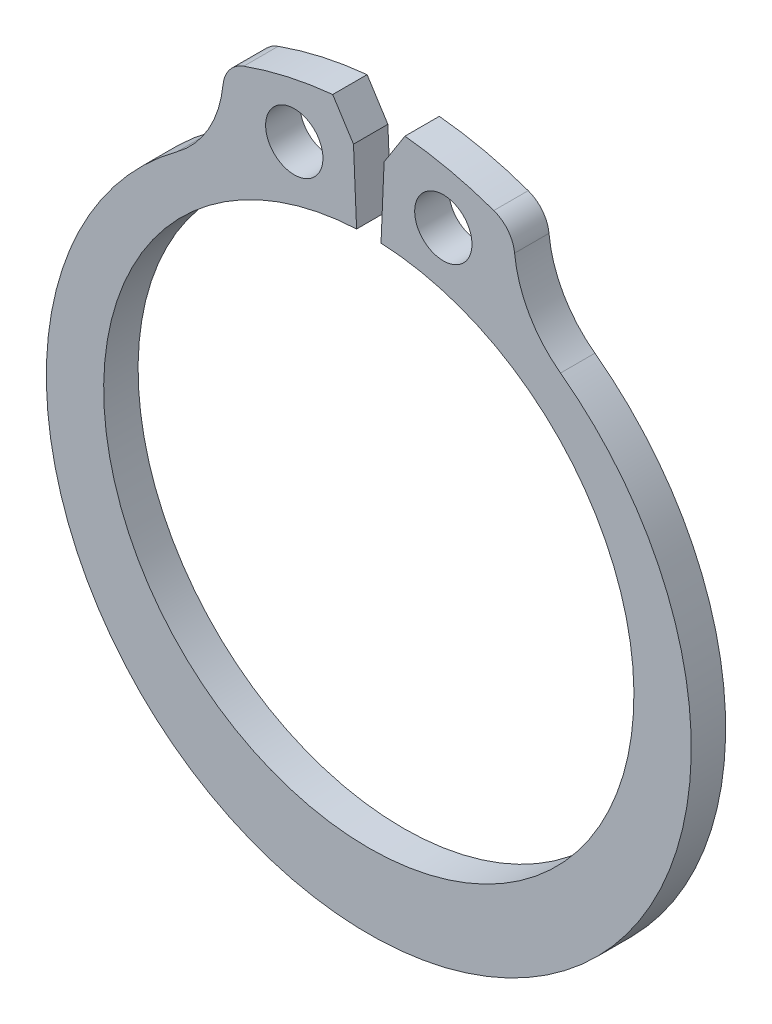
ISO-10303-21;
HEADER;
FILE_DESCRIPTION(('STEP AP214'),'2;1');
FILE_NAME('part.step','',(''),(''),'','','');
FILE_SCHEMA(('AUTOMOTIVE_DESIGN { 1 0 10303 214 1 1 1 1 }'));
ENDSEC;
DATA;
#1=APPLICATION_CONTEXT('core data for automotive mechanical design processes');
#2=APPLICATION_PROTOCOL_DEFINITION('international standard','automotive_design',2000,#1);
#3=PRODUCT_CONTEXT('',#1,'mechanical');
#4=PRODUCT('Part','Part','',(#3));
#5=PRODUCT_RELATED_PRODUCT_CATEGORY('part','',(#4));
#6=PRODUCT_DEFINITION_FORMATION('','',#4);
#7=PRODUCT_DEFINITION_CONTEXT('part definition',#1,'design');
#8=PRODUCT_DEFINITION('design','',#6,#7);
#9=PRODUCT_DEFINITION_SHAPE('','',#8);
#10=(LENGTH_UNIT() NAMED_UNIT(*) SI_UNIT(.MILLI.,.METRE.));
#11=(NAMED_UNIT(*) PLANE_ANGLE_UNIT() SI_UNIT($,.RADIAN.));
#12=(NAMED_UNIT(*) SI_UNIT($,.STERADIAN.) SOLID_ANGLE_UNIT());
#13=UNCERTAINTY_MEASURE_WITH_UNIT(LENGTH_MEASURE(1.E-05),#10,'distance_accuracy_value','');
#14=(GEOMETRIC_REPRESENTATION_CONTEXT(3) GLOBAL_UNCERTAINTY_ASSIGNED_CONTEXT((#13)) GLOBAL_UNIT_ASSIGNED_CONTEXT((#10,
#11,#12)) REPRESENTATION_CONTEXT('',''));
#15=CARTESIAN_POINT('',(0.,0.,0.));
#16=DIRECTION('',(0.,0.,1.));
#17=DIRECTION('',(1.,0.,0.));
#18=AXIS2_PLACEMENT_3D('',#15,#16,#17);
#19=CARTESIAN_POINT('',(0.,0.,0.6));
#20=DIRECTION('',(0.,0.,-1.));
#21=DIRECTION('',(1.,0.,0.));
#22=AXIS2_PLACEMENT_3D('',#19,#20,#21);
#23=CYLINDRICAL_SURFACE('',#22,9.25);
#24=DIRECTION('',(0.,0.,1.));
#25=VECTOR('',#24,1.);
#26=CARTESIAN_POINT('',(0.425920101847911,9.24018896272375,0.6));
#27=LINE('',#26,#25);
#28=CARTESIAN_POINT('',(0.425920101847911,9.24018896272375,0.));
#29=VERTEX_POINT('',#28);
#30=CARTESIAN_POINT('',(0.425920101847911,9.24018896272375,1.2));
#31=VERTEX_POINT('',#30);
#32=EDGE_CURVE('E32',#29,#31,#27,.T.);
#33=ORIENTED_EDGE('',*,*,#32,.F.);
#34=CARTESIAN_POINT('',(0.,0.,0.));
#35=DIRECTION('',(0.,0.,1.));
#36=DIRECTION('',(1.,0.,0.));
#37=AXIS2_PLACEMENT_3D('',#34,#35,#36);
#38=CIRCLE('',#37,9.25);
#39=CARTESIAN_POINT('',(-0.425920101847911,9.24018896272375,0.));
#40=VERTEX_POINT('',#39);
#41=EDGE_CURVE('E156',#40,#29,#38,.T.);
#42=ORIENTED_EDGE('',*,*,#41,.F.);
#43=DIRECTION('',(0.,0.,-1.));
#44=VECTOR('',#43,1.);
#45=CARTESIAN_POINT('',(-0.425920101847911,9.24018896272375,0.6));
#46=LINE('',#45,#44);
#47=CARTESIAN_POINT('',(-0.425920101847911,9.24018896272375,1.2));
#48=VERTEX_POINT('',#47);
#49=EDGE_CURVE('E9',#48,#40,#46,.T.);
#50=ORIENTED_EDGE('',*,*,#49,.F.);
#51=CARTESIAN_POINT('',(0.,0.,1.2));
#52=DIRECTION('',(0.,0.,-1.));
#53=DIRECTION('',(1.,0.,0.));
#54=AXIS2_PLACEMENT_3D('',#51,#52,#53);
#55=CIRCLE('',#54,9.25);
#56=EDGE_CURVE('E133',#31,#48,#55,.T.);
#57=ORIENTED_EDGE('',*,*,#56,.F.);
#58=EDGE_LOOP('',(#33,#42,#50,#57));
#59=FACE_BOUND('',#58,.T.);
#60=ADVANCED_FACE('F15',(#59),#23,.F.);
#61=CARTESIAN_POINT('',(-0.280262164671059,5.875,1.2));
#62=DIRECTION('',(0.999064573445483,0.0432432432432432,0.));
#63=DIRECTION('',(0.0432432432432432,-0.999064573445483,0.));
#64=AXIS2_PLACEMENT_3D('',#61,#62,#63);
#65=PLANE('',#64);
#66=ORIENTED_EDGE('',*,*,#49,.T.);
#67=DIRECTION('',(-0.0432432432432432,0.999064573445483,0.));
#68=VECTOR('',#67,1.);
#69=CARTESIAN_POINT('',(0.,-0.6,0.));
#70=LINE('',#69,#68);
#71=CARTESIAN_POINT('',(-0.5345540901448,11.75,0.));
#72=VERTEX_POINT('',#71);
#73=EDGE_CURVE('E24',#40,#72,#70,.T.);
#74=ORIENTED_EDGE('',*,*,#73,.T.);
#75=DIRECTION('',(0.,0.,-1.));
#76=VECTOR('',#75,1.);
#77=CARTESIAN_POINT('',(-0.5345540901448,11.75,1.2));
#78=LINE('',#77,#76);
#79=CARTESIAN_POINT('',(-0.5345540901448,11.75,1.2));
#80=VERTEX_POINT('',#79);
#81=EDGE_CURVE('E180',#80,#72,#78,.T.);
#82=ORIENTED_EDGE('',*,*,#81,.F.);
#83=DIRECTION('',(-0.0432432432432432,0.999064573445483,0.));
#84=VECTOR('',#83,1.);
#85=CARTESIAN_POINT('',(0.,-0.6,1.2));
#86=LINE('',#85,#84);
#87=EDGE_CURVE('E154',#48,#80,#86,.T.);
#88=ORIENTED_EDGE('',*,*,#87,.F.);
#89=EDGE_LOOP('',(#66,#74,#82,#88));
#90=FACE_BOUND('',#89,.T.);
#91=ADVANCED_FACE('F240',(#90),#65,.T.);
#92=CARTESIAN_POINT('',(4.16342762461539,0.248043783068695,0.));
#93=DIRECTION('',(0.,0.,1.));
#94=DIRECTION('',(1.,0.,0.));
#95=AXIS2_PLACEMENT_3D('',#92,#93,#94);
#96=PLANE('',#95);
#97=ORIENTED_EDGE('',*,*,#41,.T.);
#98=DIRECTION('',(0.0432432432432432,0.999064573445483,0.));
#99=VECTOR('',#98,1.);
#100=CARTESIAN_POINT('',(0.,-0.6,0.));
#101=LINE('',#100,#99);
#102=CARTESIAN_POINT('',(0.5345540901448,11.75,0.));
#103=VERTEX_POINT('',#102);
#104=EDGE_CURVE('E158',#29,#103,#101,.T.);
#105=ORIENTED_EDGE('',*,*,#104,.T.);
#106=DIRECTION('',(0.53698203391342,0.843593679003231,0.));
#107=VECTOR('',#106,1.);
#108=CARTESIAN_POINT('',(0.5345540901448,11.75,0.));
#109=LINE('',#108,#107);
#110=CARTESIAN_POINT('',(1.2593338033922,12.8886220509267,0.));
#111=VERTEX_POINT('',#110);
#112=EDGE_CURVE('E124',#103,#111,#109,.T.);
#113=ORIENTED_EDGE('',*,*,#112,.T.);
#114=CARTESIAN_POINT('',(0.,0.,0.));
#115=DIRECTION('',(0.,0.,1.));
#116=DIRECTION('',(1.,0.,0.));
#117=AXIS2_PLACEMENT_3D('',#114,#115,#116);
#118=CIRCLE('',#117,12.95);
#119=CARTESIAN_POINT('',(4.3619804345495,12.1932615279345,0.));
#120=VERTEX_POINT('',#119);
#121=EDGE_CURVE('E189',#120,#111,#118,.T.);
#122=ORIENTED_EDGE('',*,*,#121,.F.);
#123=CARTESIAN_POINT('',(3.99146472196228,11.1575404715076,0.));
#124=DIRECTION('',(0.,0.,1.));
#125=DIRECTION('',(1.,0.,0.));
#126=AXIS2_PLACEMENT_3D('',#123,#124,#125);
#127=CIRCLE('',#126,1.1);
#128=CARTESIAN_POINT('',(5.08606538190489,11.2663953990636,0.));
#129=VERTEX_POINT('',#128);
#130=EDGE_CURVE('E165',#129,#120,#127,.T.);
#131=ORIENTED_EDGE('',*,*,#130,.F.);
#132=CARTESIAN_POINT('',(9.06643141805981,11.6622314992671,0.));
#133=DIRECTION('',(0.,0.,1.));
#134=DIRECTION('',(1.,0.,0.));
#135=AXIS2_PLACEMENT_3D('',#132,#133,#134);
#136=CIRCLE('',#135,4.);
#137=CARTESIAN_POINT('',(6.6883510461097,8.44590848306588,0.));
#138=VERTEX_POINT('',#137);
#139=EDGE_CURVE('E120',#129,#138,#136,.T.);
#140=ORIENTED_EDGE('',*,*,#139,.T.);
#141=CARTESIAN_POINT('',(0.,-0.6,0.));
#142=DIRECTION('',(0.,0.,1.));
#143=DIRECTION('',(1.,0.,0.));
#144=AXIS2_PLACEMENT_3D('',#141,#142,#143);
#145=CIRCLE('',#144,11.25);
#146=CARTESIAN_POINT('',(-6.6883510461097,8.44590848306588,0.));
#147=VERTEX_POINT('',#146);
#148=EDGE_CURVE('E131',#147,#138,#145,.T.);
#149=ORIENTED_EDGE('',*,*,#148,.F.);
#150=CARTESIAN_POINT('',(-9.06643141805981,11.6622314992671,0.));
#151=DIRECTION('',(0.,0.,-1.));
#152=DIRECTION('',(-1.,0.,0.));
#153=AXIS2_PLACEMENT_3D('',#150,#151,#152);
#154=CIRCLE('',#153,4.);
#155=CARTESIAN_POINT('',(-5.08606538190489,11.2663953990636,0.));
#156=VERTEX_POINT('',#155);
#157=EDGE_CURVE('E177',#156,#147,#154,.T.);
#158=ORIENTED_EDGE('',*,*,#157,.F.);
#159=CARTESIAN_POINT('',(-3.99146472196228,11.1575404715076,0.));
#160=DIRECTION('',(0.,0.,1.));
#161=DIRECTION('',(-1.,0.,0.));
#162=AXIS2_PLACEMENT_3D('',#159,#160,#161);
#163=CIRCLE('',#162,1.1);
#164=CARTESIAN_POINT('',(-4.3619804345495,12.1932615279345,0.));
#165=VERTEX_POINT('',#164);
#166=EDGE_CURVE('E167',#165,#156,#163,.T.);
#167=ORIENTED_EDGE('',*,*,#166,.F.);
#168=CARTESIAN_POINT('',(0.,0.,0.));
#169=DIRECTION('',(0.,0.,1.));
#170=DIRECTION('',(-1.,0.,0.));
#171=AXIS2_PLACEMENT_3D('',#168,#169,#170);
#172=CIRCLE('',#171,12.95);
#173=CARTESIAN_POINT('',(-1.2593338033922,12.8886220509267,0.));
#174=VERTEX_POINT('',#173);
#175=EDGE_CURVE('E184',#174,#165,#172,.T.);
#176=ORIENTED_EDGE('',*,*,#175,.F.);
#177=DIRECTION('',(-0.53698203391342,0.843593679003231,0.));
#178=VECTOR('',#177,1.);
#179=CARTESIAN_POINT('',(-0.5345540901448,11.75,0.));
#180=LINE('',#179,#178);
#181=EDGE_CURVE('E127',#72,#174,#180,.T.);
#182=ORIENTED_EDGE('',*,*,#181,.F.);
#183=ORIENTED_EDGE('',*,*,#73,.F.);
#184=EDGE_LOOP('',(#97,#105,#113,#122,#131,#140,#149,#158,#167,#176,#182,#183));
#185=FACE_BOUND('',#184,.T.);
#186=CARTESIAN_POINT('',(2.6,10.7912001186152,0.));
#187=DIRECTION('',(0.,0.,1.));
#188=DIRECTION('',(1.,0.,0.));
#189=AXIS2_PLACEMENT_3D('',#186,#187,#188);
#190=CIRCLE('',#189,1.);
#191=CARTESIAN_POINT('',(1.6,10.7912001186152,0.));
#192=VERTEX_POINT('',#191);
#193=EDGE_CURVE('E116',#192,#192,#190,.T.);
#194=ORIENTED_EDGE('',*,*,#193,.T.);
#195=EDGE_LOOP('',(#194));
#196=FACE_BOUND('',#195,.T.);
#197=CARTESIAN_POINT('',(-2.6,10.7912001186152,0.));
#198=DIRECTION('',(0.,0.,1.));
#199=DIRECTION('',(-1.,0.,0.));
#200=AXIS2_PLACEMENT_3D('',#197,#198,#199);
#201=CIRCLE('',#200,1.);
#202=CARTESIAN_POINT('',(-1.6,10.7912001186152,0.));
#203=VERTEX_POINT('',#202);
#204=EDGE_CURVE('E121',#203,#203,#201,.T.);
#205=ORIENTED_EDGE('',*,*,#204,.T.);
#206=EDGE_LOOP('',(#205));
#207=FACE_BOUND('',#206,.T.);
#208=ADVANCED_FACE('F17',(#185,#196,#207),#96,.F.);
#209=CARTESIAN_POINT('',(-2.6,10.7912001186152,0.6));
#210=DIRECTION('',(0.,0.,1.));
#211=DIRECTION('',(-1.,0.,0.));
#212=AXIS2_PLACEMENT_3D('',#209,#210,#211);
#213=CYLINDRICAL_SURFACE('',#212,1.);
#214=CARTESIAN_POINT('',(-2.6,10.7912001186152,1.2));
#215=DIRECTION('',(0.,0.,-1.));
#216=DIRECTION('',(-1.,0.,0.));
#217=AXIS2_PLACEMENT_3D('',#214,#215,#216);
#218=CIRCLE('',#217,1.);
#219=CARTESIAN_POINT('',(-1.6,10.7912001186152,1.2));
#220=VERTEX_POINT('',#219);
#221=EDGE_CURVE('E98',#220,#220,#218,.T.);
#222=ORIENTED_EDGE('',*,*,#221,.F.);
#223=EDGE_LOOP('',(#222));
#224=FACE_BOUND('',#223,.T.);
#225=ORIENTED_EDGE('',*,*,#204,.F.);
#226=EDGE_LOOP('',(#225));
#227=FACE_BOUND('',#226,.T.);
#228=ADVANCED_FACE('F254',(#224,#227),#213,.F.);
#229=CARTESIAN_POINT('',(-0.896943946768501,12.3193110254633,1.2));
#230=DIRECTION('',(0.843593679003231,0.53698203391342,0.));
#231=DIRECTION('',(0.53698203391342,-0.843593679003231,0.));
#232=AXIS2_PLACEMENT_3D('',#229,#230,#231);
#233=PLANE('',#232);
#234=ORIENTED_EDGE('',*,*,#181,.T.);
#235=DIRECTION('',(0.,0.,-1.));
#236=VECTOR('',#235,1.);
#237=CARTESIAN_POINT('',(-1.2593338033922,12.8886220509267,1.2));
#238=LINE('',#237,#236);
#239=CARTESIAN_POINT('',(-1.2593338033922,12.8886220509267,1.2));
#240=VERTEX_POINT('',#239);
#241=EDGE_CURVE('E170',#240,#174,#238,.T.);
#242=ORIENTED_EDGE('',*,*,#241,.F.);
#243=DIRECTION('',(-0.53698203391342,0.843593679003231,0.));
#244=VECTOR('',#243,1.);
#245=CARTESIAN_POINT('',(-0.5345540901448,11.75,1.2));
#246=LINE('',#245,#244);
#247=EDGE_CURVE('E104',#80,#240,#246,.T.);
#248=ORIENTED_EDGE('',*,*,#247,.F.);
#249=ORIENTED_EDGE('',*,*,#81,.T.);
#250=EDGE_LOOP('',(#234,#242,#248,#249));
#251=FACE_BOUND('',#250,.T.);
#252=ADVANCED_FACE('F251',(#251),#233,.T.);
#253=CARTESIAN_POINT('',(0.,0.,1.2));
#254=DIRECTION('',(0.,0.,1.));
#255=DIRECTION('',(-1.,0.,0.));
#256=AXIS2_PLACEMENT_3D('',#253,#254,#255);
#257=CYLINDRICAL_SURFACE('',#256,12.95);
#258=ORIENTED_EDGE('',*,*,#175,.T.);
#259=DIRECTION('',(0.,0.,-1.));
#260=VECTOR('',#259,1.);
#261=CARTESIAN_POINT('',(-4.3619804345495,12.1932615279345,1.2));
#262=LINE('',#261,#260);
#263=CARTESIAN_POINT('',(-4.3619804345495,12.1932615279345,1.2));
#264=VERTEX_POINT('',#263);
#265=EDGE_CURVE('E174',#264,#165,#262,.T.);
#266=ORIENTED_EDGE('',*,*,#265,.F.);
#267=CARTESIAN_POINT('',(0.,0.,1.2));
#268=DIRECTION('',(0.,0.,-1.));
#269=DIRECTION('',(-1.,0.,0.));
#270=AXIS2_PLACEMENT_3D('',#267,#268,#269);
#271=CIRCLE('',#270,12.95);
#272=EDGE_CURVE('E181',#264,#240,#271,.T.);
#273=ORIENTED_EDGE('',*,*,#272,.T.);
#274=ORIENTED_EDGE('',*,*,#241,.T.);
#275=EDGE_LOOP('',(#258,#266,#273,#274));
#276=FACE_BOUND('',#275,.T.);
#277=ADVANCED_FACE('F253',(#276),#257,.T.);
#278=CARTESIAN_POINT('',(-3.99146472196228,11.1575404715076,1.2));
#279=DIRECTION('',(0.,0.,1.));
#280=DIRECTION('',(-1.,0.,0.));
#281=AXIS2_PLACEMENT_3D('',#278,#279,#280);
#282=CYLINDRICAL_SURFACE('',#281,1.1);
#283=ORIENTED_EDGE('',*,*,#166,.T.);
#284=DIRECTION('',(0.,0.,-1.));
#285=VECTOR('',#284,1.);
#286=CARTESIAN_POINT('',(-5.08606538190489,11.2663953990636,1.2));
#287=LINE('',#286,#285);
#288=CARTESIAN_POINT('',(-5.08606538190489,11.2663953990636,1.2));
#289=VERTEX_POINT('',#288);
#290=EDGE_CURVE('E153',#289,#156,#287,.T.);
#291=ORIENTED_EDGE('',*,*,#290,.F.);
#292=CARTESIAN_POINT('',(-3.99146472196228,11.1575404715076,1.2));
#293=DIRECTION('',(0.,0.,-1.));
#294=DIRECTION('',(-1.,0.,0.));
#295=AXIS2_PLACEMENT_3D('',#292,#293,#294);
#296=CIRCLE('',#295,1.1);
#297=EDGE_CURVE('E171',#289,#264,#296,.T.);
#298=ORIENTED_EDGE('',*,*,#297,.T.);
#299=ORIENTED_EDGE('',*,*,#265,.T.);
#300=EDGE_LOOP('',(#283,#291,#298,#299));
#301=FACE_BOUND('',#300,.T.);
#302=ADVANCED_FACE('F234',(#301),#282,.T.);
#303=CARTESIAN_POINT('',(-9.06643141805981,11.6622314992671,1.2));
#304=DIRECTION('',(0.,0.,1.));
#305=DIRECTION('',(-1.,0.,0.));
#306=AXIS2_PLACEMENT_3D('',#303,#304,#305);
#307=CYLINDRICAL_SURFACE('',#306,4.);
#308=ORIENTED_EDGE('',*,*,#157,.T.);
#309=DIRECTION('',(0.,0.,-1.));
#310=VECTOR('',#309,1.);
#311=CARTESIAN_POINT('',(-6.6883510461097,8.44590848306588,1.2));
#312=LINE('',#311,#310);
#313=CARTESIAN_POINT('',(-6.6883510461097,8.44590848306588,1.2));
#314=VERTEX_POINT('',#313);
#315=EDGE_CURVE('E143',#314,#147,#312,.T.);
#316=ORIENTED_EDGE('',*,*,#315,.F.);
#317=CARTESIAN_POINT('',(-9.06643141805981,11.6622314992671,1.2));
#318=DIRECTION('',(0.,0.,-1.));
#319=DIRECTION('',(-1.,0.,0.));
#320=AXIS2_PLACEMENT_3D('',#317,#318,#319);
#321=CIRCLE('',#320,4.);
#322=EDGE_CURVE('E160',#289,#314,#321,.T.);
#323=ORIENTED_EDGE('',*,*,#322,.F.);
#324=ORIENTED_EDGE('',*,*,#290,.T.);
#325=EDGE_LOOP('',(#308,#316,#323,#324));
#326=FACE_BOUND('',#325,.T.);
#327=ADVANCED_FACE('F225',(#326),#307,.F.);
#328=CARTESIAN_POINT('',(2.6,10.7912001186152,0.6));
#329=DIRECTION('',(0.,0.,-1.));
#330=DIRECTION('',(1.,0.,0.));
#331=AXIS2_PLACEMENT_3D('',#328,#329,#330);
#332=CYLINDRICAL_SURFACE('',#331,1.);
#333=ORIENTED_EDGE('',*,*,#193,.F.);
#334=EDGE_LOOP('',(#333));
#335=FACE_BOUND('',#334,.T.);
#336=CARTESIAN_POINT('',(2.6,10.7912001186152,1.2));
#337=DIRECTION('',(0.,0.,-1.));
#338=DIRECTION('',(1.,0.,0.));
#339=AXIS2_PLACEMENT_3D('',#336,#337,#338);
#340=CIRCLE('',#339,1.);
#341=CARTESIAN_POINT('',(1.6,10.7912001186152,1.2));
#342=VERTEX_POINT('',#341);
#343=EDGE_CURVE('E135',#342,#342,#340,.T.);
#344=ORIENTED_EDGE('',*,*,#343,.F.);
#345=EDGE_LOOP('',(#344));
#346=FACE_BOUND('',#345,.T.);
#347=ADVANCED_FACE('F117',(#335,#346),#332,.F.);
#348=CARTESIAN_POINT('',(0.280262164671059,5.875,0.));
#349=DIRECTION('',(-0.999064573445483,0.0432432432432432,0.));
#350=DIRECTION('',(-0.0432432432432432,-0.999064573445483,0.));
#351=AXIS2_PLACEMENT_3D('',#348,#349,#350);
#352=PLANE('',#351);
#353=ORIENTED_EDGE('',*,*,#32,.T.);
#354=DIRECTION('',(0.0432432432432432,0.999064573445483,0.));
#355=VECTOR('',#354,1.);
#356=CARTESIAN_POINT('',(0.,-0.6,1.2));
#357=LINE('',#356,#355);
#358=CARTESIAN_POINT('',(0.5345540901448,11.75,1.2));
#359=VERTEX_POINT('',#358);
#360=EDGE_CURVE('E150',#31,#359,#357,.T.);
#361=ORIENTED_EDGE('',*,*,#360,.T.);
#362=DIRECTION('',(0.,0.,1.));
#363=VECTOR('',#362,1.);
#364=CARTESIAN_POINT('',(0.5345540901448,11.75,0.));
#365=LINE('',#364,#363);
#366=EDGE_CURVE('E151',#103,#359,#365,.T.);
#367=ORIENTED_EDGE('',*,*,#366,.F.);
#368=ORIENTED_EDGE('',*,*,#104,.F.);
#369=EDGE_LOOP('',(#353,#361,#367,#368));
#370=FACE_BOUND('',#369,.T.);
#371=ADVANCED_FACE('F224',(#370),#352,.T.);
#372=CARTESIAN_POINT('',(0.896943946768501,12.3193110254633,0.));
#373=DIRECTION('',(-0.843593679003231,0.53698203391342,0.));
#374=DIRECTION('',(-0.53698203391342,-0.843593679003231,0.));
#375=AXIS2_PLACEMENT_3D('',#372,#373,#374);
#376=PLANE('',#375);
#377=DIRECTION('',(0.53698203391342,0.843593679003231,0.));
#378=VECTOR('',#377,1.);
#379=CARTESIAN_POINT('',(0.5345540901448,11.75,1.2));
#380=LINE('',#379,#378);
#381=CARTESIAN_POINT('',(1.2593338033922,12.8886220509267,1.2));
#382=VERTEX_POINT('',#381);
#383=EDGE_CURVE('E147',#359,#382,#380,.T.);
#384=ORIENTED_EDGE('',*,*,#383,.T.);
#385=DIRECTION('',(0.,0.,1.));
#386=VECTOR('',#385,1.);
#387=CARTESIAN_POINT('',(1.2593338033922,12.8886220509267,0.));
#388=LINE('',#387,#386);
#389=EDGE_CURVE('E164',#111,#382,#388,.T.);
#390=ORIENTED_EDGE('',*,*,#389,.F.);
#391=ORIENTED_EDGE('',*,*,#112,.F.);
#392=ORIENTED_EDGE('',*,*,#366,.T.);
#393=EDGE_LOOP('',(#384,#390,#391,#392));
#394=FACE_BOUND('',#393,.T.);
#395=ADVANCED_FACE('F232',(#394),#376,.T.);
#396=CARTESIAN_POINT('',(0.,0.,0.));
#397=DIRECTION('',(0.,0.,-1.));
#398=DIRECTION('',(1.,0.,0.));
#399=AXIS2_PLACEMENT_3D('',#396,#397,#398);
#400=CYLINDRICAL_SURFACE('',#399,12.95);
#401=CARTESIAN_POINT('',(0.,0.,1.2));
#402=DIRECTION('',(0.,0.,-1.));
#403=DIRECTION('',(1.,0.,0.));
#404=AXIS2_PLACEMENT_3D('',#401,#402,#403);
#405=CIRCLE('',#404,12.95);
#406=CARTESIAN_POINT('',(4.3619804345495,12.1932615279345,1.2));
#407=VERTEX_POINT('',#406);
#408=EDGE_CURVE('E195',#382,#407,#405,.T.);
#409=ORIENTED_EDGE('',*,*,#408,.T.);
#410=DIRECTION('',(0.,0.,1.));
#411=VECTOR('',#410,1.);
#412=CARTESIAN_POINT('',(4.3619804345495,12.1932615279345,0.));
#413=LINE('',#412,#411);
#414=EDGE_CURVE('E141',#120,#407,#413,.T.);
#415=ORIENTED_EDGE('',*,*,#414,.F.);
#416=ORIENTED_EDGE('',*,*,#121,.T.);
#417=ORIENTED_EDGE('',*,*,#389,.T.);
#418=EDGE_LOOP('',(#409,#415,#416,#417));
#419=FACE_BOUND('',#418,.T.);
#420=ADVANCED_FACE('F249',(#419),#400,.T.);
#421=CARTESIAN_POINT('',(3.99146472196228,11.1575404715076,0.));
#422=DIRECTION('',(0.,0.,-1.));
#423=DIRECTION('',(1.,0.,0.));
#424=AXIS2_PLACEMENT_3D('',#421,#422,#423);
#425=CYLINDRICAL_SURFACE('',#424,1.1);
#426=CARTESIAN_POINT('',(3.99146472196228,11.1575404715076,1.2));
#427=DIRECTION('',(0.,0.,-1.));
#428=DIRECTION('',(1.,0.,0.));
#429=AXIS2_PLACEMENT_3D('',#426,#427,#428);
#430=CIRCLE('',#429,1.1);
#431=CARTESIAN_POINT('',(5.08606538190489,11.2663953990636,1.2));
#432=VERTEX_POINT('',#431);
#433=EDGE_CURVE('E161',#407,#432,#430,.T.);
#434=ORIENTED_EDGE('',*,*,#433,.T.);
#435=DIRECTION('',(0.,0.,1.));
#436=VECTOR('',#435,1.);
#437=CARTESIAN_POINT('',(5.08606538190489,11.2663953990636,0.));
#438=LINE('',#437,#436);
#439=EDGE_CURVE('E142',#129,#432,#438,.T.);
#440=ORIENTED_EDGE('',*,*,#439,.F.);
#441=ORIENTED_EDGE('',*,*,#130,.T.);
#442=ORIENTED_EDGE('',*,*,#414,.T.);
#443=EDGE_LOOP('',(#434,#440,#441,#442));
#444=FACE_BOUND('',#443,.T.);
#445=ADVANCED_FACE('F262',(#444),#425,.T.);
#446=CARTESIAN_POINT('',(9.06643141805981,11.6622314992671,0.));
#447=DIRECTION('',(0.,0.,-1.));
#448=DIRECTION('',(1.,0.,0.));
#449=AXIS2_PLACEMENT_3D('',#446,#447,#448);
#450=CYLINDRICAL_SURFACE('',#449,4.);
#451=CARTESIAN_POINT('',(9.06643141805981,11.6622314992671,1.2));
#452=DIRECTION('',(0.,0.,1.));
#453=DIRECTION('',(1.,0.,0.));
#454=AXIS2_PLACEMENT_3D('',#451,#452,#453);
#455=CIRCLE('',#454,4.);
#456=CARTESIAN_POINT('',(6.6883510461097,8.44590848306588,1.2));
#457=VERTEX_POINT('',#456);
#458=EDGE_CURVE('E138',#432,#457,#455,.T.);
#459=ORIENTED_EDGE('',*,*,#458,.T.);
#460=DIRECTION('',(0.,0.,1.));
#461=VECTOR('',#460,1.);
#462=CARTESIAN_POINT('',(6.6883510461097,8.44590848306588,0.));
#463=LINE('',#462,#461);
#464=EDGE_CURVE('E132',#138,#457,#463,.T.);
#465=ORIENTED_EDGE('',*,*,#464,.F.);
#466=ORIENTED_EDGE('',*,*,#139,.F.);
#467=ORIENTED_EDGE('',*,*,#439,.T.);
#468=EDGE_LOOP('',(#459,#465,#466,#467));
#469=FACE_BOUND('',#468,.T.);
#470=ADVANCED_FACE('F290',(#469),#450,.F.);
#471=CARTESIAN_POINT('',(0.,-0.6,0.));
#472=DIRECTION('',(0.,0.,-1.));
#473=DIRECTION('',(1.,0.,0.));
#474=AXIS2_PLACEMENT_3D('',#471,#472,#473);
#475=CYLINDRICAL_SURFACE('',#474,11.25);
#476=CARTESIAN_POINT('',(0.,-0.6,1.2));
#477=DIRECTION('',(0.,0.,-1.));
#478=DIRECTION('',(1.,0.,0.));
#479=AXIS2_PLACEMENT_3D('',#476,#477,#478);
#480=CIRCLE('',#479,11.25);
#481=EDGE_CURVE('E146',#457,#314,#480,.T.);
#482=ORIENTED_EDGE('',*,*,#481,.T.);
#483=ORIENTED_EDGE('',*,*,#315,.T.);
#484=ORIENTED_EDGE('',*,*,#148,.T.);
#485=ORIENTED_EDGE('',*,*,#464,.T.);
#486=EDGE_LOOP('',(#482,#483,#484,#485));
#487=FACE_BOUND('',#486,.T.);
#488=ADVANCED_FACE('F220',(#487),#475,.T.);
#489=CARTESIAN_POINT('',(4.16342762461539,0.248043783068695,1.2));
#490=DIRECTION('',(0.,0.,1.));
#491=DIRECTION('',(1.,0.,0.));
#492=AXIS2_PLACEMENT_3D('',#489,#490,#491);
#493=PLANE('',#492);
#494=ORIENTED_EDGE('',*,*,#56,.T.);
#495=ORIENTED_EDGE('',*,*,#87,.T.);
#496=ORIENTED_EDGE('',*,*,#247,.T.);
#497=ORIENTED_EDGE('',*,*,#272,.F.);
#498=ORIENTED_EDGE('',*,*,#297,.F.);
#499=ORIENTED_EDGE('',*,*,#322,.T.);
#500=ORIENTED_EDGE('',*,*,#481,.F.);
#501=ORIENTED_EDGE('',*,*,#458,.F.);
#502=ORIENTED_EDGE('',*,*,#433,.F.);
#503=ORIENTED_EDGE('',*,*,#408,.F.);
#504=ORIENTED_EDGE('',*,*,#383,.F.);
#505=ORIENTED_EDGE('',*,*,#360,.F.);
#506=EDGE_LOOP('',(#494,#495,#496,#497,#498,#499,#500,#501,#502,#503,#504,#505));
#507=FACE_BOUND('',#506,.T.);
#508=ORIENTED_EDGE('',*,*,#221,.T.);
#509=EDGE_LOOP('',(#508));
#510=FACE_BOUND('',#509,.T.);
#511=ORIENTED_EDGE('',*,*,#343,.T.);
#512=EDGE_LOOP('',(#511));
#513=FACE_BOUND('',#512,.T.);
#514=ADVANCED_FACE('F217',(#507,#510,#513),#493,.T.);
#515=CLOSED_SHELL('',(#60,#91,#208,#228,#252,#277,#302,#327,#347,#371,#395,#420,#445,#470,#488,#514));
#516=MANIFOLD_SOLID_BREP('B1',#515);
#517=ADVANCED_BREP_SHAPE_REPRESENTATION('',(#18,#516),#14);
#518=SHAPE_DEFINITION_REPRESENTATION(#9,#517);
ENDSEC;
END-ISO-10303-21;
